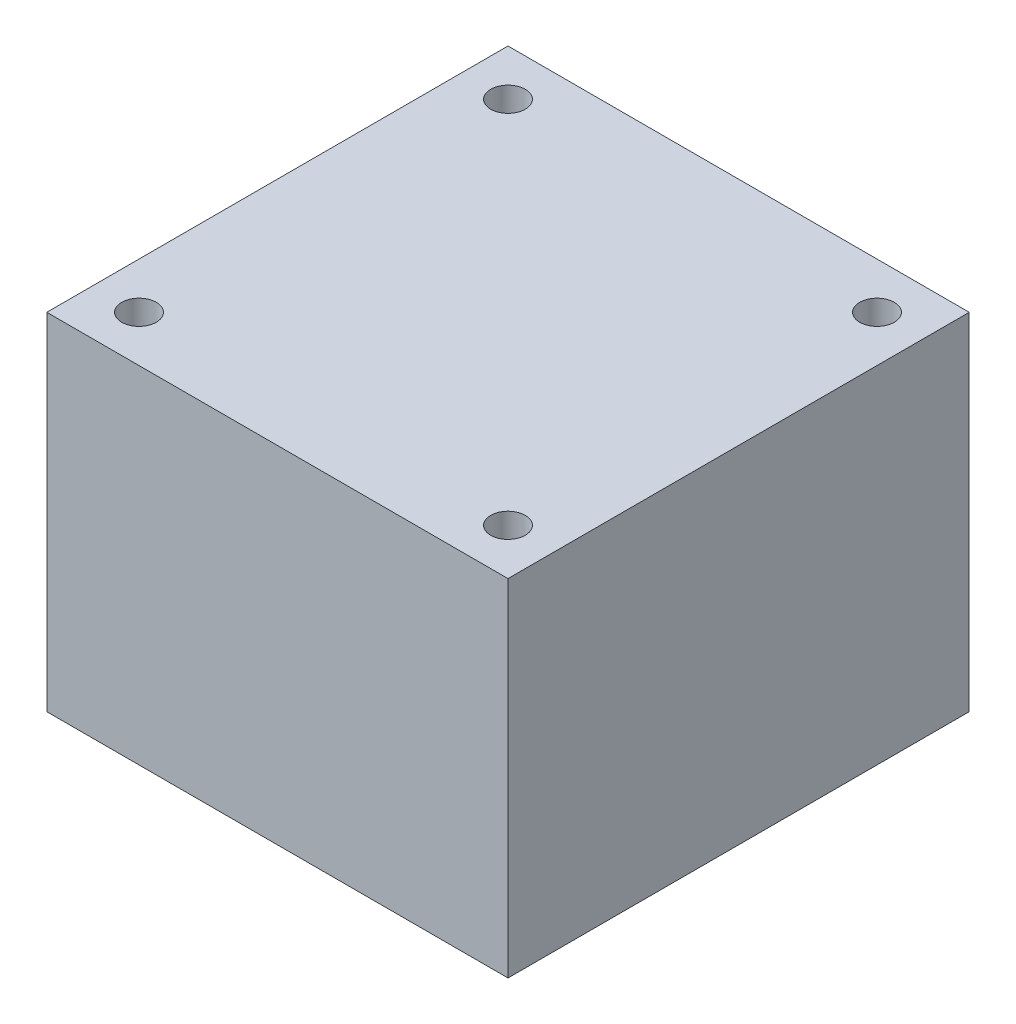
ISO-10303-21;
HEADER;
FILE_DESCRIPTION(('STEP AP214'),'2;1');
FILE_NAME('part.step','',(''),(''),'','','');
FILE_SCHEMA(('AUTOMOTIVE_DESIGN { 1 0 10303 214 1 1 1 1 }'));
ENDSEC;
DATA;
#1=APPLICATION_CONTEXT('core data for automotive mechanical design processes');
#2=APPLICATION_PROTOCOL_DEFINITION('international standard','automotive_design',2000,#1);
#3=PRODUCT_CONTEXT('',#1,'mechanical');
#4=PRODUCT('Part','Part','',(#3));
#5=PRODUCT_RELATED_PRODUCT_CATEGORY('part','',(#4));
#6=PRODUCT_DEFINITION_FORMATION('','',#4);
#7=PRODUCT_DEFINITION_CONTEXT('part definition',#1,'design');
#8=PRODUCT_DEFINITION('design','',#6,#7);
#9=PRODUCT_DEFINITION_SHAPE('','',#8);
#10=(LENGTH_UNIT() NAMED_UNIT(*) SI_UNIT(.MILLI.,.METRE.));
#11=(NAMED_UNIT(*) PLANE_ANGLE_UNIT() SI_UNIT($,.RADIAN.));
#12=(NAMED_UNIT(*) SI_UNIT($,.STERADIAN.) SOLID_ANGLE_UNIT());
#13=UNCERTAINTY_MEASURE_WITH_UNIT(LENGTH_MEASURE(1.E-05),#10,'distance_accuracy_value','');
#14=(GEOMETRIC_REPRESENTATION_CONTEXT(3) GLOBAL_UNCERTAINTY_ASSIGNED_CONTEXT((#13)) GLOBAL_UNIT_ASSIGNED_CONTEXT((#10,
#11,#12)) REPRESENTATION_CONTEXT('',''));
#15=CARTESIAN_POINT('',(0.,0.,0.));
#16=DIRECTION('',(0.,0.,1.));
#17=DIRECTION('',(1.,0.,0.));
#18=AXIS2_PLACEMENT_3D('',#15,#16,#17);
#19=CARTESIAN_POINT('',(20.,30.,-20.));
#20=DIRECTION('',(-1.,0.,0.));
#21=DIRECTION('',(0.,0.,1.));
#22=AXIS2_PLACEMENT_3D('',#19,#20,#21);
#23=PLANE('',#22);
#24=DIRECTION('',(0.,0.,-1.));
#25=VECTOR('',#24,1.);
#26=CARTESIAN_POINT('',(20.,0.,-20.));
#27=LINE('',#26,#25);
#28=CARTESIAN_POINT('',(20.,0.,20.));
#29=VERTEX_POINT('',#28);
#30=CARTESIAN_POINT('',(20.,0.,-20.));
#31=VERTEX_POINT('',#30);
#32=EDGE_CURVE('E107',#29,#31,#27,.T.);
#33=ORIENTED_EDGE('',*,*,#32,.T.);
#34=DIRECTION('',(0.,-1.,0.));
#35=VECTOR('',#34,1.);
#36=CARTESIAN_POINT('',(20.,30.,-20.));
#37=LINE('',#36,#35);
#38=CARTESIAN_POINT('',(20.,30.,-20.));
#39=VERTEX_POINT('',#38);
#40=EDGE_CURVE('E11',#39,#31,#37,.T.);
#41=ORIENTED_EDGE('',*,*,#40,.F.);
#42=DIRECTION('',(0.,0.,-1.));
#43=VECTOR('',#42,1.);
#44=CARTESIAN_POINT('',(20.,30.,-20.));
#45=LINE('',#44,#43);
#46=CARTESIAN_POINT('',(20.,30.,20.));
#47=VERTEX_POINT('',#46);
#48=EDGE_CURVE('E91',#47,#39,#45,.T.);
#49=ORIENTED_EDGE('',*,*,#48,.F.);
#50=DIRECTION('',(0.,-1.,0.));
#51=VECTOR('',#50,1.);
#52=CARTESIAN_POINT('',(20.,30.,20.));
#53=LINE('',#52,#51);
#54=EDGE_CURVE('E103',#47,#29,#53,.T.);
#55=ORIENTED_EDGE('',*,*,#54,.T.);
#56=EDGE_LOOP('',(#33,#41,#49,#55));
#57=FACE_BOUND('',#56,.T.);
#58=ADVANCED_FACE('F39',(#57),#23,.F.);
#59=CARTESIAN_POINT('',(-20.,30.,-20.));
#60=DIRECTION('',(0.,0.,1.));
#61=DIRECTION('',(1.,0.,0.));
#62=AXIS2_PLACEMENT_3D('',#59,#60,#61);
#63=PLANE('',#62);
#64=DIRECTION('',(-1.,0.,0.));
#65=VECTOR('',#64,1.);
#66=CARTESIAN_POINT('',(-20.,0.,-20.));
#67=LINE('',#66,#65);
#68=CARTESIAN_POINT('',(-20.,0.,-20.));
#69=VERTEX_POINT('',#68);
#70=EDGE_CURVE('E96',#31,#69,#67,.T.);
#71=ORIENTED_EDGE('',*,*,#70,.T.);
#72=DIRECTION('',(0.,-1.,0.));
#73=VECTOR('',#72,1.);
#74=CARTESIAN_POINT('',(-20.,30.,-20.));
#75=LINE('',#74,#73);
#76=CARTESIAN_POINT('',(-20.,30.,-20.));
#77=VERTEX_POINT('',#76);
#78=EDGE_CURVE('E48',#77,#69,#75,.T.);
#79=ORIENTED_EDGE('',*,*,#78,.F.);
#80=DIRECTION('',(-1.,0.,0.));
#81=VECTOR('',#80,1.);
#82=CARTESIAN_POINT('',(-20.,30.,-20.));
#83=LINE('',#82,#81);
#84=EDGE_CURVE('E86',#39,#77,#83,.T.);
#85=ORIENTED_EDGE('',*,*,#84,.F.);
#86=ORIENTED_EDGE('',*,*,#40,.T.);
#87=EDGE_LOOP('',(#71,#79,#85,#86));
#88=FACE_BOUND('',#87,.T.);
#89=ADVANCED_FACE('F95',(#88),#63,.F.);
#90=CARTESIAN_POINT('',(-20.,30.,-20.));
#91=DIRECTION('',(1.,0.,0.));
#92=DIRECTION('',(0.,0.,-1.));
#93=AXIS2_PLACEMENT_3D('',#90,#91,#92);
#94=PLANE('',#93);
#95=DIRECTION('',(0.,0.,1.));
#96=VECTOR('',#95,1.);
#97=CARTESIAN_POINT('',(-20.,0.,-20.));
#98=LINE('',#97,#96);
#99=CARTESIAN_POINT('',(-20.,0.,20.));
#100=VERTEX_POINT('',#99);
#101=EDGE_CURVE('E73',#69,#100,#98,.T.);
#102=ORIENTED_EDGE('',*,*,#101,.T.);
#103=DIRECTION('',(0.,-1.,0.));
#104=VECTOR('',#103,1.);
#105=CARTESIAN_POINT('',(-20.,30.,20.));
#106=LINE('',#105,#104);
#107=CARTESIAN_POINT('',(-20.,30.,20.));
#108=VERTEX_POINT('',#107);
#109=EDGE_CURVE('E98',#108,#100,#106,.T.);
#110=ORIENTED_EDGE('',*,*,#109,.F.);
#111=DIRECTION('',(0.,0.,1.));
#112=VECTOR('',#111,1.);
#113=CARTESIAN_POINT('',(-20.,30.,-20.));
#114=LINE('',#113,#112);
#115=EDGE_CURVE('E89',#77,#108,#114,.T.);
#116=ORIENTED_EDGE('',*,*,#115,.F.);
#117=ORIENTED_EDGE('',*,*,#78,.T.);
#118=EDGE_LOOP('',(#102,#110,#116,#117));
#119=FACE_BOUND('',#118,.T.);
#120=ADVANCED_FACE('F99',(#119),#94,.F.);
#121=CARTESIAN_POINT('',(-20.,30.,20.));
#122=DIRECTION('',(0.,0.,-1.));
#123=DIRECTION('',(-1.,0.,0.));
#124=AXIS2_PLACEMENT_3D('',#121,#122,#123);
#125=PLANE('',#124);
#126=DIRECTION('',(1.,0.,0.));
#127=VECTOR('',#126,1.);
#128=CARTESIAN_POINT('',(-20.,0.,20.));
#129=LINE('',#128,#127);
#130=EDGE_CURVE('E79',#100,#29,#129,.T.);
#131=ORIENTED_EDGE('',*,*,#130,.T.);
#132=ORIENTED_EDGE('',*,*,#54,.F.);
#133=DIRECTION('',(1.,0.,0.));
#134=VECTOR('',#133,1.);
#135=CARTESIAN_POINT('',(-20.,30.,20.));
#136=LINE('',#135,#134);
#137=EDGE_CURVE('E56',#108,#47,#136,.T.);
#138=ORIENTED_EDGE('',*,*,#137,.F.);
#139=ORIENTED_EDGE('',*,*,#109,.T.);
#140=EDGE_LOOP('',(#131,#132,#138,#139));
#141=FACE_BOUND('',#140,.T.);
#142=ADVANCED_FACE('F121',(#141),#125,.F.);
#143=CARTESIAN_POINT('',(0.,30.,0.));
#144=DIRECTION('',(0.,1.,0.));
#145=DIRECTION('',(0.,0.,1.));
#146=AXIS2_PLACEMENT_3D('',#143,#144,#145);
#147=PLANE('',#146);
#148=CARTESIAN_POINT('',(-16.,30.,16.));
#149=DIRECTION('',(0.,1.,0.));
#150=DIRECTION('',(0.,0.,1.));
#151=AXIS2_PLACEMENT_3D('',#148,#149,#150);
#152=CIRCLE('',#151,1.5);
#153=CARTESIAN_POINT('',(-16.,30.,17.5));
#154=VERTEX_POINT('',#153);
#155=EDGE_CURVE('E136',#154,#154,#152,.T.);
#156=ORIENTED_EDGE('',*,*,#155,.F.);
#157=EDGE_LOOP('',(#156));
#158=FACE_BOUND('',#157,.T.);
#159=CARTESIAN_POINT('',(16.,30.,16.));
#160=DIRECTION('',(0.,1.,0.));
#161=DIRECTION('',(0.,0.,1.));
#162=AXIS2_PLACEMENT_3D('',#159,#160,#161);
#163=CIRCLE('',#162,1.5);
#164=CARTESIAN_POINT('',(16.,30.,17.5));
#165=VERTEX_POINT('',#164);
#166=EDGE_CURVE('E144',#165,#165,#163,.T.);
#167=ORIENTED_EDGE('',*,*,#166,.F.);
#168=EDGE_LOOP('',(#167));
#169=FACE_BOUND('',#168,.T.);
#170=CARTESIAN_POINT('',(16.,30.,-16.));
#171=DIRECTION('',(0.,1.,0.));
#172=DIRECTION('',(0.,0.,1.));
#173=AXIS2_PLACEMENT_3D('',#170,#171,#172);
#174=CIRCLE('',#173,1.5);
#175=CARTESIAN_POINT('',(16.,30.,-14.5));
#176=VERTEX_POINT('',#175);
#177=EDGE_CURVE('E152',#176,#176,#174,.T.);
#178=ORIENTED_EDGE('',*,*,#177,.F.);
#179=EDGE_LOOP('',(#178));
#180=FACE_BOUND('',#179,.T.);
#181=CARTESIAN_POINT('',(-16.,30.,-16.));
#182=DIRECTION('',(0.,1.,0.));
#183=DIRECTION('',(0.,0.,1.));
#184=AXIS2_PLACEMENT_3D('',#181,#182,#183);
#185=CIRCLE('',#184,1.5);
#186=CARTESIAN_POINT('',(-16.,30.,-14.5));
#187=VERTEX_POINT('',#186);
#188=EDGE_CURVE('E128',#187,#187,#185,.T.);
#189=ORIENTED_EDGE('',*,*,#188,.F.);
#190=EDGE_LOOP('',(#189));
#191=FACE_BOUND('',#190,.T.);
#192=ORIENTED_EDGE('',*,*,#48,.T.);
#193=ORIENTED_EDGE('',*,*,#84,.T.);
#194=ORIENTED_EDGE('',*,*,#115,.T.);
#195=ORIENTED_EDGE('',*,*,#137,.T.);
#196=EDGE_LOOP('',(#192,#193,#194,#195));
#197=FACE_BOUND('',#196,.T.);
#198=ADVANCED_FACE('F87',(#158,#169,#180,#191,#197),#147,.T.);
#199=CARTESIAN_POINT('',(0.,0.,0.));
#200=DIRECTION('',(0.,1.,0.));
#201=DIRECTION('',(0.,0.,1.));
#202=AXIS2_PLACEMENT_3D('',#199,#200,#201);
#203=PLANE('',#202);
#204=CARTESIAN_POINT('',(-16.,0.,16.));
#205=DIRECTION('',(0.,1.,0.));
#206=DIRECTION('',(0.,0.,1.));
#207=AXIS2_PLACEMENT_3D('',#204,#205,#206);
#208=CIRCLE('',#207,1.5);
#209=CARTESIAN_POINT('',(-16.,0.,17.5));
#210=VERTEX_POINT('',#209);
#211=EDGE_CURVE('E140',#210,#210,#208,.T.);
#212=ORIENTED_EDGE('',*,*,#211,.T.);
#213=EDGE_LOOP('',(#212));
#214=FACE_BOUND('',#213,.T.);
#215=CARTESIAN_POINT('',(16.,0.,16.));
#216=DIRECTION('',(0.,1.,0.));
#217=DIRECTION('',(0.,0.,1.));
#218=AXIS2_PLACEMENT_3D('',#215,#216,#217);
#219=CIRCLE('',#218,1.5);
#220=CARTESIAN_POINT('',(16.,0.,17.5));
#221=VERTEX_POINT('',#220);
#222=EDGE_CURVE('E148',#221,#221,#219,.T.);
#223=ORIENTED_EDGE('',*,*,#222,.T.);
#224=EDGE_LOOP('',(#223));
#225=FACE_BOUND('',#224,.T.);
#226=CARTESIAN_POINT('',(16.,0.,-16.));
#227=DIRECTION('',(0.,1.,0.));
#228=DIRECTION('',(0.,0.,1.));
#229=AXIS2_PLACEMENT_3D('',#226,#227,#228);
#230=CIRCLE('',#229,1.5);
#231=CARTESIAN_POINT('',(16.,0.,-14.5));
#232=VERTEX_POINT('',#231);
#233=EDGE_CURVE('E132',#232,#232,#230,.T.);
#234=ORIENTED_EDGE('',*,*,#233,.T.);
#235=EDGE_LOOP('',(#234));
#236=FACE_BOUND('',#235,.T.);
#237=CARTESIAN_POINT('',(-16.,0.,-16.));
#238=DIRECTION('',(0.,1.,0.));
#239=DIRECTION('',(0.,0.,1.));
#240=AXIS2_PLACEMENT_3D('',#237,#238,#239);
#241=CIRCLE('',#240,1.5);
#242=CARTESIAN_POINT('',(-16.,0.,-14.5));
#243=VERTEX_POINT('',#242);
#244=EDGE_CURVE('E111',#243,#243,#241,.T.);
#245=ORIENTED_EDGE('',*,*,#244,.T.);
#246=EDGE_LOOP('',(#245));
#247=FACE_BOUND('',#246,.T.);
#248=ORIENTED_EDGE('',*,*,#32,.F.);
#249=ORIENTED_EDGE('',*,*,#130,.F.);
#250=ORIENTED_EDGE('',*,*,#101,.F.);
#251=ORIENTED_EDGE('',*,*,#70,.F.);
#252=EDGE_LOOP('',(#248,#249,#250,#251));
#253=FACE_BOUND('',#252,.T.);
#254=ADVANCED_FACE('F124',(#214,#225,#236,#247,#253),#203,.F.);
#255=CARTESIAN_POINT('',(-16.,0.,-16.));
#256=DIRECTION('',(0.,1.,0.));
#257=DIRECTION('',(0.,0.,1.));
#258=AXIS2_PLACEMENT_3D('',#255,#256,#257);
#259=CYLINDRICAL_SURFACE('',#258,1.5);
#260=ORIENTED_EDGE('',*,*,#244,.F.);
#261=EDGE_LOOP('',(#260));
#262=FACE_BOUND('',#261,.T.);
#263=ORIENTED_EDGE('',*,*,#188,.T.);
#264=EDGE_LOOP('',(#263));
#265=FACE_BOUND('',#264,.T.);
#266=ADVANCED_FACE('F166',(#262,#265),#259,.F.);
#267=CARTESIAN_POINT('',(16.,0.,-16.));
#268=DIRECTION('',(0.,1.,0.));
#269=DIRECTION('',(0.,0.,1.));
#270=AXIS2_PLACEMENT_3D('',#267,#268,#269);
#271=CYLINDRICAL_SURFACE('',#270,1.5);
#272=ORIENTED_EDGE('',*,*,#233,.F.);
#273=EDGE_LOOP('',(#272));
#274=FACE_BOUND('',#273,.T.);
#275=ORIENTED_EDGE('',*,*,#177,.T.);
#276=EDGE_LOOP('',(#275));
#277=FACE_BOUND('',#276,.T.);
#278=ADVANCED_FACE('F162',(#274,#277),#271,.F.);
#279=CARTESIAN_POINT('',(16.,0.,16.));
#280=DIRECTION('',(0.,1.,0.));
#281=DIRECTION('',(0.,0.,1.));
#282=AXIS2_PLACEMENT_3D('',#279,#280,#281);
#283=CYLINDRICAL_SURFACE('',#282,1.5);
#284=ORIENTED_EDGE('',*,*,#222,.F.);
#285=EDGE_LOOP('',(#284));
#286=FACE_BOUND('',#285,.T.);
#287=ORIENTED_EDGE('',*,*,#166,.T.);
#288=EDGE_LOOP('',(#287));
#289=FACE_BOUND('',#288,.T.);
#290=ADVANCED_FACE('F165',(#286,#289),#283,.F.);
#291=CARTESIAN_POINT('',(-16.,0.,16.));
#292=DIRECTION('',(0.,1.,0.));
#293=DIRECTION('',(0.,0.,1.));
#294=AXIS2_PLACEMENT_3D('',#291,#292,#293);
#295=CYLINDRICAL_SURFACE('',#294,1.5);
#296=ORIENTED_EDGE('',*,*,#211,.F.);
#297=EDGE_LOOP('',(#296));
#298=FACE_BOUND('',#297,.T.);
#299=ORIENTED_EDGE('',*,*,#155,.T.);
#300=EDGE_LOOP('',(#299));
#301=FACE_BOUND('',#300,.T.);
#302=ADVANCED_FACE('F227',(#298,#301),#295,.F.);
#303=CLOSED_SHELL('',(#58,#89,#120,#142,#198,#254,#266,#278,#290,#302));
#304=MANIFOLD_SOLID_BREP('B2',#303);
#305=ADVANCED_BREP_SHAPE_REPRESENTATION('',(#18,#304),#14);
#306=SHAPE_DEFINITION_REPRESENTATION(#9,#305);
ENDSEC;
END-ISO-10303-21;
